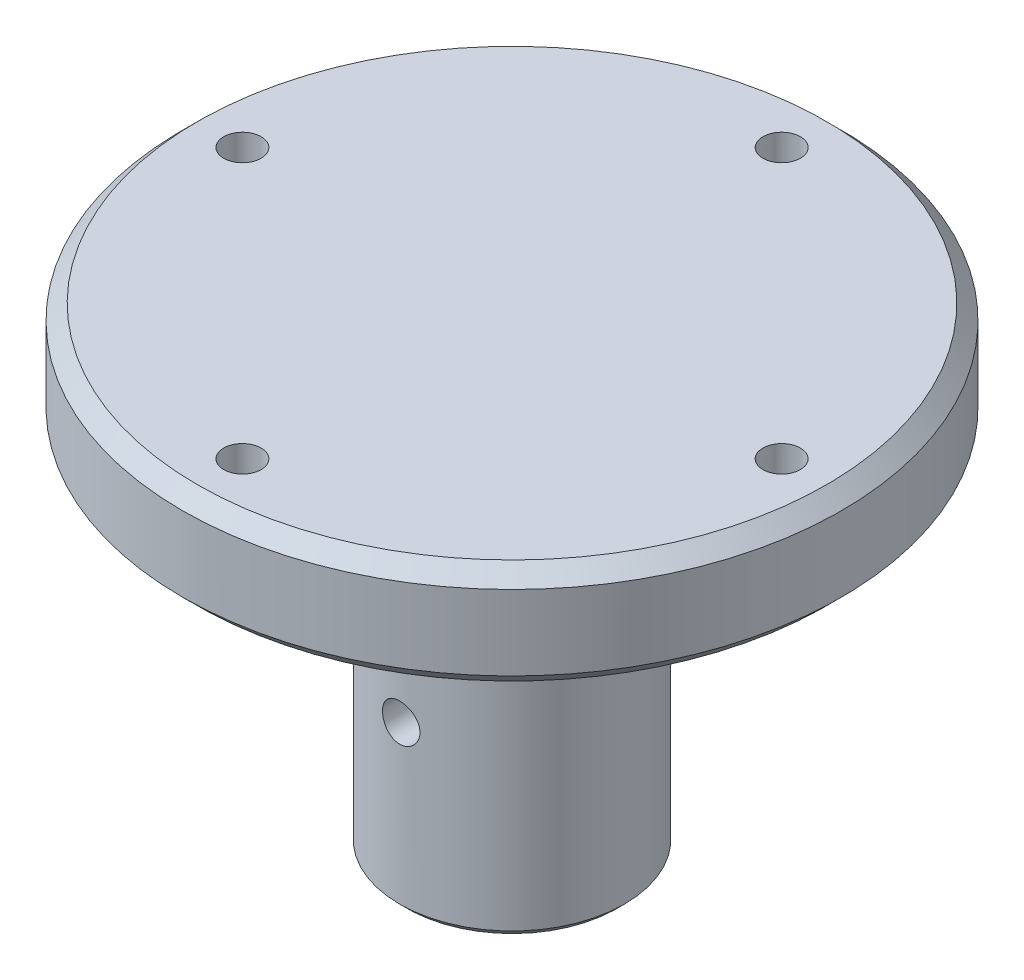
ISO-10303-21;
HEADER;
FILE_DESCRIPTION(('STEP AP214'),'2;1');
FILE_NAME('part.step','',(''),(''),'','','');
FILE_SCHEMA(('AUTOMOTIVE_DESIGN { 1 0 10303 214 1 1 1 1 }'));
ENDSEC;
DATA;
#1=APPLICATION_CONTEXT('core data for automotive mechanical design processes');
#2=APPLICATION_PROTOCOL_DEFINITION('international standard','automotive_design',2000,#1);
#3=PRODUCT_CONTEXT('',#1,'mechanical');
#4=PRODUCT('Part','Part','',(#3));
#5=PRODUCT_RELATED_PRODUCT_CATEGORY('part','',(#4));
#6=PRODUCT_DEFINITION_FORMATION('','',#4);
#7=PRODUCT_DEFINITION_CONTEXT('part definition',#1,'design');
#8=PRODUCT_DEFINITION('design','',#6,#7);
#9=PRODUCT_DEFINITION_SHAPE('','',#8);
#10=(LENGTH_UNIT() NAMED_UNIT(*) SI_UNIT(.MILLI.,.METRE.));
#11=(NAMED_UNIT(*) PLANE_ANGLE_UNIT() SI_UNIT($,.RADIAN.));
#12=(NAMED_UNIT(*) SI_UNIT($,.STERADIAN.) SOLID_ANGLE_UNIT());
#13=UNCERTAINTY_MEASURE_WITH_UNIT(LENGTH_MEASURE(1.E-05),#10,'distance_accuracy_value','');
#14=(GEOMETRIC_REPRESENTATION_CONTEXT(3) GLOBAL_UNCERTAINTY_ASSIGNED_CONTEXT((#13)) GLOBAL_UNIT_ASSIGNED_CONTEXT((#10,
#11,#12)) REPRESENTATION_CONTEXT('',''));
#15=CARTESIAN_POINT('',(0.,0.,0.));
#16=DIRECTION('',(0.,0.,1.));
#17=DIRECTION('',(1.,0.,0.));
#18=AXIS2_PLACEMENT_3D('',#15,#16,#17);
#19=CARTESIAN_POINT('',(0.,28.,0.));
#20=DIRECTION('',(0.,1.,0.));
#21=DIRECTION('',(0.,0.,1.));
#22=AXIS2_PLACEMENT_3D('',#19,#20,#21);
#23=CYLINDRICAL_SURFACE('',#22,7.5);
#24=CARTESIAN_POINT('',(0.,-2.99999999999999,0.));
#25=DIRECTION('',(0.,-1.,0.));
#26=DIRECTION('',(0.,0.,-1.));
#27=AXIS2_PLACEMENT_3D('',#24,#25,#26);
#28=CIRCLE('',#27,7.5);
#29=CARTESIAN_POINT('',(0.,-2.99999999999999,-7.5));
#30=VERTEX_POINT('',#29);
#31=EDGE_CURVE('E205',#30,#30,#28,.F.);
#32=ORIENTED_EDGE('',*,*,#31,.T.);
#33=EDGE_LOOP('',(#32));
#34=FACE_BOUND('',#33,.T.);
#35=CARTESIAN_POINT('',(0.,18.,0.));
#36=DIRECTION('',(0.,1.,0.));
#37=DIRECTION('',(0.,0.,1.));
#38=AXIS2_PLACEMENT_3D('',#35,#36,#37);
#39=CIRCLE('',#38,7.5);
#40=CARTESIAN_POINT('',(0.,18.,7.5));
#41=VERTEX_POINT('',#40);
#42=EDGE_CURVE('E155',#41,#41,#39,.T.);
#43=ORIENTED_EDGE('',*,*,#42,.F.);
#44=EDGE_LOOP('',(#43));
#45=FACE_BOUND('',#44,.T.);
#46=CARTESIAN_POINT('',(0.,6.25,7.5));
#47=CARTESIAN_POINT('',(-0.0696954524791074,6.2500027944739,7.49999880584412));
#48=CARTESIAN_POINT('',(-0.13942894091941,6.25584863748446,7.49901838956517));
#49=CARTESIAN_POINT('',(-0.276940110836521,6.27906782938266,7.49520172470694));
#50=CARTESIAN_POINT('',(-0.344715933979623,6.2964517784558,7.49236376961945));
#51=CARTESIAN_POINT('',(-0.476302373606322,6.34220772429637,7.48515034118225));
#52=CARTESIAN_POINT('',(-0.54011618421595,6.37057073282028,7.48077612579596));
#53=CARTESIAN_POINT('',(-0.662070920988972,6.43745614602619,7.47097113541035));
#54=CARTESIAN_POINT('',(-0.720212494939295,6.4759773887415,7.46554048127217));
#55=CARTESIAN_POINT('',(-0.82973630714584,6.56247754191023,7.45416658729156));
#56=CARTESIAN_POINT('',(-0.881056451767484,6.61053455731806,7.44821935907428));
#57=CARTESIAN_POINT('',(-0.974944249329964,6.7145739842364,7.43651313438366));
#58=CARTESIAN_POINT('',(-1.01751134969549,6.7705568957283,7.43075414981334));
#59=CARTESIAN_POINT('',(-1.09293356280257,6.88928548309852,7.4200378287989));
#60=CARTESIAN_POINT('',(-1.1257272764305,6.95207066840237,7.41508564545818));
#61=CARTESIAN_POINT('',(-1.18027918270561,7.08235478215031,7.40659894897337));
#62=CARTESIAN_POINT('',(-1.20203812078281,7.14985339183881,7.40306434007154));
#63=CARTESIAN_POINT('',(-1.2337071888924,7.28699013742827,7.39785268421378));
#64=CARTESIAN_POINT('',(-1.2437245145677,7.35660286825069,7.3961588424285));
#65=CARTESIAN_POINT('',(-1.25195836264494,7.49654013844173,7.39476969468325));
#66=CARTESIAN_POINT('',(-1.2501757201945,7.56686462708365,7.39507424728607));
#67=CARTESIAN_POINT('',(-1.23494754919808,7.70546393063772,7.39763214431778));
#68=CARTESIAN_POINT('',(-1.22162244094489,7.77375240177261,7.39986536659458));
#69=CARTESIAN_POINT('',(-1.18387657020172,7.90711065891456,7.40599747605504));
#70=CARTESIAN_POINT('',(-1.15945542715987,7.97218033444427,7.40989642036636));
#71=CARTESIAN_POINT('',(-1.10008862304696,8.09761441172046,7.4189423966705));
#72=CARTESIAN_POINT('',(-1.06509295693986,8.15795470304061,7.42409533553663));
#73=CARTESIAN_POINT('',(-0.985606008778716,8.27195220026919,7.43506459207504));
#74=CARTESIAN_POINT('',(-0.941113960327143,8.32560886622746,7.44088096327143));
#75=CARTESIAN_POINT('',(-0.843241106079526,8.42541304290367,7.45261013939893));
#76=CARTESIAN_POINT('',(-0.789756981936562,8.47145925927004,7.45852324615826));
#77=CARTESIAN_POINT('',(-0.675767624490822,8.55393888133267,7.46971300698362));
#78=CARTESIAN_POINT('',(-0.61526234595321,8.59037222509161,7.47498965694873));
#79=CARTESIAN_POINT('',(-0.488852958083355,8.65260111356814,7.48431946446456));
#80=CARTESIAN_POINT('',(-0.42294436278233,8.67838770966562,7.48837159203724));
#81=CARTESIAN_POINT('',(-0.287649172801365,8.71849710762299,7.4947875150633));
#82=CARTESIAN_POINT('',(-0.218262869589734,8.73282086848686,7.49715145175237));
#83=CARTESIAN_POINT('',(-0.0788549506508116,8.74946067923056,7.49990564921343));
#84=CARTESIAN_POINT('',(-0.00885036857550541,8.7519157859028,7.50031876506392));
#85=CARTESIAN_POINT('',(0.130569886444944,8.74511932778593,7.49918737210585));
#86=CARTESIAN_POINT('',(0.19998558194602,8.73586821343313,7.49764293862059));
#87=CARTESIAN_POINT('',(0.335828087773382,8.70603757533226,7.49278413469101));
#88=CARTESIAN_POINT('',(0.40227043419269,8.68552689580493,7.48948052400655));
#89=CARTESIAN_POINT('',(0.530773442430222,8.63383274090023,7.48147232227679));
#90=CARTESIAN_POINT('',(0.59283385795486,8.60264866618236,7.4767676525601));
#91=CARTESIAN_POINT('',(0.711415344734478,8.5301744376516,7.46642258151204));
#92=CARTESIAN_POINT('',(0.767882625468573,8.48879742191637,7.46077427943511));
#93=CARTESIAN_POINT('',(0.873121792751343,8.39723134230747,7.4491923369595));
#94=CARTESIAN_POINT('',(0.921893119848291,8.34704163836166,7.44325867585773));
#95=CARTESIAN_POINT('',(1.010871389829,8.23865122596428,7.43170087617923));
#96=CARTESIAN_POINT('',(1.05098438055686,8.18037291724279,7.42608058068553));
#97=CARTESIAN_POINT('',(1.12085115514749,8.05782351543073,7.41585764888942));
#98=CARTESIAN_POINT('',(1.15060526738491,7.99355261238625,7.4112549803301));
#99=CARTESIAN_POINT('',(1.19876916573657,7.86110513359393,7.40361726848852));
#100=CARTESIAN_POINT('',(1.21722571627397,7.79294595248475,7.40057577155532));
#101=CARTESIAN_POINT('',(1.24241772688914,7.65443993538911,7.3963885841763));
#102=CARTESIAN_POINT('',(1.24915420597308,7.58409329013397,7.39524272891361));
#103=CARTESIAN_POINT('',(1.25068643302368,7.44414741701879,7.39498366542006));
#104=CARTESIAN_POINT('',(1.24563006806259,7.37454981071235,7.39584528252825));
#105=CARTESIAN_POINT('',(1.22403991947842,7.23721037597461,7.39944890726864));
#106=CARTESIAN_POINT('',(1.20750617305624,7.16946854152906,7.40219090880607));
#107=CARTESIAN_POINT('',(1.16348724479745,7.03782078135369,7.40923678140859));
#108=CARTESIAN_POINT('',(1.13601479530022,6.97391049497198,7.41353883609835));
#109=CARTESIAN_POINT('',(1.07091350195795,6.85158216540257,7.42322184461104));
#110=CARTESIAN_POINT('',(1.03328415437428,6.79316439481393,7.428602851942));
#111=CARTESIAN_POINT('',(0.948409442186077,6.68273220844612,7.43991727022811));
#112=CARTESIAN_POINT('',(0.901055281796823,6.63080199164986,7.44585647788151));
#113=CARTESIAN_POINT('',(0.798304515690115,6.53557419776253,7.4575718618042));
#114=CARTESIAN_POINT('',(0.742906056456318,6.49227861568091,7.46334800013273));
#115=CARTESIAN_POINT('',(0.62518458482014,6.41527586590002,7.4741326482111));
#116=CARTESIAN_POINT('',(0.562816393766409,6.38163698034352,7.47913558126552));
#117=CARTESIAN_POINT('',(0.43325653468949,6.32536525769504,7.48775583800888));
#118=CARTESIAN_POINT('',(0.366069747415004,6.30272145946015,7.49137454088741));
#119=CARTESIAN_POINT('',(0.2488516550227,6.27399736293666,7.49602895416478));
#120=CARTESIAN_POINT('',(0.199529415149223,6.26501276519201,7.49751013636679));
#121=CARTESIAN_POINT('',(0.100144655159904,6.25301313107762,7.4994960799306));
#122=CARTESIAN_POINT('',(0.050082147804247,6.24999799193132,7.50000085810321));
#123=CARTESIAN_POINT('',(0.,6.25,7.5));
#124=B_SPLINE_CURVE_WITH_KNOTS('',3,(#46,#47,#48,#49,#50,#51,#52,#53,#54,#55,#56,#57,#58,#59,
#60,#61,#62,#63,#64,#65,#66,#67,#68,#69,#70,#71,#72,#73,#74,#75,#76,#77,#78,#79,#80,#81,#82,#83,
#84,#85,#86,#87,#88,#89,#90,#91,#92,#93,#94,#95,#96,#97,#98,#99,#100,#101,#102,#103,#104,#105,
#106,#107,#108,#109,#110,#111,#112,#113,#114,#115,#116,#117,#118,#119,#120,#121,#122,#123),
.UNSPECIFIED.,.T.,.F.,(4,2,2,2,2,2,2,2,2,2,2,2,2,2,2,2,2,2,2,2,2,2,2,2,2,2,2,2,2,2,2,2,2,2,2,2,
2,2,4),(0.,0.208903292469255,0.41799877284771,0.626923433512635,0.835824206337395,
1.04651245531166,1.25721400084928,1.4692126041192,1.68119688438091,1.89123038551712,
2.10124902160443,2.30910260880204,2.51696332512691,2.72582278316279,2.93469910340287,
3.14616384955663,3.35762995817924,3.56927344457952,3.78089922260574,3.99003941745699,
4.1991715651793,4.40703903503208,4.61491817913033,4.82463412813512,5.03436531527141,
5.24626911003809,5.45816618687971,5.66918011170886,5.88017568893309,6.0885395476135,
6.29690273094066,6.50502409113111,6.71315577514668,6.92375692096696,7.13440666939486,
7.346511158036,7.55840376065036,7.70852124082009,7.85863613638484),.UNSPECIFIED.);
#125=CARTESIAN_POINT('',(0.,6.25,7.5));
#126=VERTEX_POINT('',#125);
#127=EDGE_CURVE('E124',#126,#126,#124,.T.);
#128=ORIENTED_EDGE('',*,*,#127,.T.);
#129=EDGE_LOOP('',(#128));
#130=FACE_BOUND('',#129,.T.);
#131=ADVANCED_FACE('F39',(#34,#45,#130),#23,.T.);
#132=CARTESIAN_POINT('',(0.,28.,0.));
#133=DIRECTION('',(0.,1.,0.));
#134=DIRECTION('',(0.,0.,1.));
#135=AXIS2_PLACEMENT_3D('',#132,#133,#134);
#136=CYLINDRICAL_SURFACE('',#135,5.25);
#137=CARTESIAN_POINT('',(0.,-3.5,0.));
#138=DIRECTION('',(0.,-1.,0.));
#139=DIRECTION('',(0.,0.,-1.));
#140=AXIS2_PLACEMENT_3D('',#137,#138,#139);
#141=CIRCLE('',#140,5.25);
#142=CARTESIAN_POINT('',(0.,-3.5,-5.25));
#143=VERTEX_POINT('',#142);
#144=EDGE_CURVE('E131',#143,#143,#141,.T.);
#145=ORIENTED_EDGE('',*,*,#144,.T.);
#146=EDGE_LOOP('',(#145));
#147=FACE_BOUND('',#146,.T.);
#148=CARTESIAN_POINT('',(0.,18.,0.));
#149=DIRECTION('',(0.,1.,0.));
#150=DIRECTION('',(0.,0.,1.));
#151=AXIS2_PLACEMENT_3D('',#148,#149,#150);
#152=CIRCLE('',#151,5.25);
#153=CARTESIAN_POINT('',(0.,18.,5.25));
#154=VERTEX_POINT('',#153);
#155=EDGE_CURVE('E217',#154,#154,#152,.T.);
#156=ORIENTED_EDGE('',*,*,#155,.T.);
#157=EDGE_LOOP('',(#156));
#158=FACE_BOUND('',#157,.T.);
#159=CARTESIAN_POINT('',(0.,6.25,5.25));
#160=CARTESIAN_POINT('',(0.0691680686395409,6.25000212090374,5.24999877172941));
#161=CARTESIAN_POINT('',(0.138360554784569,6.25576041223236,5.24861935169754));
#162=CARTESIAN_POINT('',(0.274769425378824,6.27861114335809,5.24325005425527));
#163=CARTESIAN_POINT('',(0.34198454716393,6.29571066789117,5.23925854512409));
#164=CARTESIAN_POINT('',(0.472448526403737,6.34066948630875,5.2291080308497));
#165=CARTESIAN_POINT('',(0.53570180937274,6.36851651639877,5.22295149688797));
#166=CARTESIAN_POINT('',(0.65663806877896,6.43413835481243,5.20913006027443));
#167=CARTESIAN_POINT('',(0.714320985998155,6.47191326866256,5.20146514158976));
#168=CARTESIAN_POINT('',(0.823564922672426,6.55706966744816,5.18530085751388));
#169=CARTESIAN_POINT('',(0.875006204130396,6.60460251129248,5.17678959319304));
#170=CARTESIAN_POINT('',(0.969266898418434,6.70760107819039,5.15997279770312));
#171=CARTESIAN_POINT('',(1.01208542302238,6.76306761748476,5.15166728780591));
#172=CARTESIAN_POINT('',(1.08843443993912,6.88127123760563,5.13608352132232));
#173=CARTESIAN_POINT('',(1.12183355232848,6.94409535790147,5.12882042927914));
#174=CARTESIAN_POINT('',(1.177551649953,7.07466680545168,5.11631635350492));
#175=CARTESIAN_POINT('',(1.1998722271293,7.14241342375799,5.11107507927089));
#176=CARTESIAN_POINT('',(1.2323961959208,7.27959694428074,5.10332996022905));
#177=CARTESIAN_POINT('',(1.2428136090463,7.34898031812985,5.10077783159059));
#178=CARTESIAN_POINT('',(1.25190173722783,7.48855324997177,5.09855525266107));
#179=CARTESIAN_POINT('',(1.25057417589362,7.55874268816241,5.09888437953714));
#180=CARTESIAN_POINT('',(1.23638137776679,7.69631482810458,5.1023435974099));
#181=CARTESIAN_POINT('',(1.22376859252614,7.76372535329093,5.10541239830265));
#182=CARTESIAN_POINT('',(1.18776500120499,7.89544513029449,5.11390782054308));
#183=CARTESIAN_POINT('',(1.16437349128584,7.9597541792858,5.11933459586254));
#184=CARTESIAN_POINT('',(1.10725479569322,8.08413534395708,5.13199238726162));
#185=CARTESIAN_POINT('',(1.07343384938,8.14416267946686,5.13923965526495));
#186=CARTESIAN_POINT('',(0.996482037436221,8.25778176380062,5.15471236628343));
#187=CARTESIAN_POINT('',(0.95334968343075,8.31137248163446,5.1629379655847));
#188=CARTESIAN_POINT('',(0.857680386906595,8.41204655088141,5.17970054395313));
#189=CARTESIAN_POINT('',(0.804929740919126,8.45892662971735,5.18824008485406));
#190=CARTESIAN_POINT('',(0.692215006411049,8.54321162863139,5.20447648042823));
#191=CARTESIAN_POINT('',(0.632250736032499,8.58061630975759,5.21217331384718));
#192=CARTESIAN_POINT('',(0.506537525314541,8.64495357914496,5.2258897870934));
#193=CARTESIAN_POINT('',(0.440772414869066,8.67185568254828,5.23190453034941));
#194=CARTESIAN_POINT('',(0.305478953926926,8.71416797518822,5.24154327338564));
#195=CARTESIAN_POINT('',(0.235951256816263,8.72958015286483,5.24516768682245));
#196=CARTESIAN_POINT('',(0.0968464143009734,8.74817052668575,5.24955710210653));
#197=CARTESIAN_POINT('',(0.0273082978944183,8.75162586554676,5.25038686760684));
#198=CARTESIAN_POINT('',(-0.111352028931327,8.74696106537931,5.24927677707357));
#199=CARTESIAN_POINT('',(-0.180474272641646,8.73884186562914,5.24733714577758));
#200=CARTESIAN_POINT('',(-0.315395370774877,8.71148752162802,5.24094746133172));
#201=CARTESIAN_POINT('',(-0.381226148626263,8.69240126995477,5.23653105269405));
#202=CARTESIAN_POINT('',(-0.508749816183273,8.64382277373171,5.22568395100027));
#203=CARTESIAN_POINT('',(-0.570442311138487,8.61432953813585,5.21925306611427));
#204=CARTESIAN_POINT('',(-0.689058096044281,8.54522133692091,5.20493322327648));
#205=CARTESIAN_POINT('',(-0.745886451756852,8.50544813703924,5.19702205936491));
#206=CARTESIAN_POINT('',(-0.852161175457277,8.41711363871614,5.18065801778436));
#207=CARTESIAN_POINT('',(-0.901606392265088,8.36855097242568,5.17220505593123));
#208=CARTESIAN_POINT('',(-0.992835326997375,8.26273467368196,5.15548063856991));
#209=CARTESIAN_POINT('',(-1.03442554231205,8.20531266680804,5.14721732477685));
#210=CARTESIAN_POINT('',(-1.10737641230327,8.08413852935511,5.13201826888524));
#211=CARTESIAN_POINT('',(-1.13873752486724,8.02038668228673,5.12508246736874));
#212=CARTESIAN_POINT('',(-1.19011254195338,7.88871042870295,5.11339678176253));
#213=CARTESIAN_POINT('',(-1.21019322729826,7.82081327457785,5.10863406509623));
#214=CARTESIAN_POINT('',(-1.23862243697181,7.68247773791993,5.10181655477155));
#215=CARTESIAN_POINT('',(-1.24697324683998,7.61203985318688,5.09976123358818));
#216=CARTESIAN_POINT('',(-1.2515947705447,7.47258389321294,5.09862873365589));
#217=CARTESIAN_POINT('',(-1.24817370754124,7.4035764777074,5.09947556540881));
#218=CARTESIAN_POINT('',(-1.23004754603087,7.26715248142545,5.10387777717907));
#219=CARTESIAN_POINT('',(-1.21534263489508,7.19973587425242,5.10743311222103));
#220=CARTESIAN_POINT('',(-1.17522711610857,7.06870663236542,5.11681142310526));
#221=CARTESIAN_POINT('',(-1.14986921604156,7.00507700681989,5.12262322408568));
#222=CARTESIAN_POINT('',(-1.08921023192302,6.88293233401316,5.13586220161999));
#223=CARTESIAN_POINT('',(-1.05390789940594,6.82441793014765,5.14328958097363));
#224=CARTESIAN_POINT('',(-0.973373809024705,6.71266324453943,5.15914360656127));
#225=CARTESIAN_POINT('',(-0.927925850899425,6.65958151125096,5.16758981852093));
#226=CARTESIAN_POINT('',(-0.828818704906808,6.56169744092588,5.18440750389839));
#227=CARTESIAN_POINT('',(-0.775157594798894,6.51689704752197,5.19277895933318));
#228=CARTESIAN_POINT('',(-0.660111053414893,6.4361527446914,5.20866347099706));
#229=CARTESIAN_POINT('',(-0.598615739416763,6.40036206071934,5.21616064396593));
#230=CARTESIAN_POINT('',(-0.470311211532101,6.33968325310903,5.22928789587304));
#231=CARTESIAN_POINT('',(-0.403506113102599,6.31478678120443,5.2349194036692));
#232=CARTESIAN_POINT('',(-0.280618279359618,6.28059575959753,5.2427792175381));
#233=CARTESIAN_POINT('',(-0.225154654325348,6.2691459630838,5.24546914998374));
#234=CARTESIAN_POINT('',(-0.113132752873805,6.25384745029091,5.24907998898554));
#235=CARTESIAN_POINT('',(-0.0565745441810867,6.24999826525208,5.25000100463769));
#236=CARTESIAN_POINT('',(0.,6.25,5.25));
#237=B_SPLINE_CURVE_WITH_KNOTS('',3,(#159,#160,#161,#162,#163,#164,#165,#166,#167,#168,#169,
#170,#171,#172,#173,#174,#175,#176,#177,#178,#179,#180,#181,#182,#183,#184,#185,#186,#187,#188,
#189,#190,#191,#192,#193,#194,#195,#196,#197,#198,#199,#200,#201,#202,#203,#204,#205,#206,#207,
#208,#209,#210,#211,#212,#213,#214,#215,#216,#217,#218,#219,#220,#221,#222,#223,#224,#225,#226,
#227,#228,#229,#230,#231,#232,#233,#234,#235,#236),.UNSPECIFIED.,.T.,.F.,(4,2,2,2,2,2,2,2,2,2,2,
2,2,2,2,2,2,2,2,2,2,2,2,2,2,2,2,2,2,2,2,2,2,2,2,2,2,2,4),(0.,0.207296977965339,
0.414723574053834,0.621914175680715,0.829106979688583,1.03979628707083,1.25050728637022,
1.46402629710099,1.67751461711585,1.88710078686866,2.09665619974102,2.30163789536393,
2.50663297795925,2.71352751671416,2.92045515088892,3.13271505412589,3.34498030962961,
3.55785718660568,3.77069721467374,3.97856960347747,4.18642512431674,4.39152324140487,
4.59664089504288,4.80512629630423,5.01364417077024,5.22677100908705,5.43988830585367,
5.65173026760457,5.86353094670328,6.06982870351051,6.27612303476602,6.4814084897231,
6.68671972856785,6.89691430355396,7.10715814880005,7.32076697454769,7.53421182334509,
7.70377641625453,7.87333055112019),.UNSPECIFIED.);
#238=CARTESIAN_POINT('',(0.,6.25,5.25));
#239=VERTEX_POINT('',#238);
#240=EDGE_CURVE('E132',#239,#239,#237,.T.);
#241=ORIENTED_EDGE('',*,*,#240,.T.);
#242=EDGE_LOOP('',(#241));
#243=FACE_BOUND('',#242,.T.);
#244=ADVANCED_FACE('F159',(#147,#158,#243),#136,.F.);
#245=CARTESIAN_POINT('',(0.,18.,7.5));
#246=DIRECTION('',(0.,-1.,0.));
#247=DIRECTION('',(0.,0.,-1.));
#248=AXIS2_PLACEMENT_3D('',#245,#246,#247);
#249=PLANE('',#248);
#250=CARTESIAN_POINT('',(0.,18.,0.));
#251=DIRECTION('',(0.,-1.,0.));
#252=DIRECTION('',(0.,0.,-1.));
#253=AXIS2_PLACEMENT_3D('',#250,#251,#252);
#254=CIRCLE('',#253,8.5);
#255=CARTESIAN_POINT('',(0.,18.,-8.5));
#256=VERTEX_POINT('',#255);
#257=EDGE_CURVE('E259',#256,#256,#254,.T.);
#258=ORIENTED_EDGE('',*,*,#257,.T.);
#259=EDGE_LOOP('',(#258));
#260=FACE_BOUND('',#259,.T.);
#261=ORIENTED_EDGE('',*,*,#42,.T.);
#262=EDGE_LOOP('',(#261));
#263=FACE_BOUND('',#262,.T.);
#264=ADVANCED_FACE('F163',(#260,#263),#249,.T.);
#265=CARTESIAN_POINT('',(0.,28.,0.));
#266=DIRECTION('',(0.,1.,0.));
#267=DIRECTION('',(0.,0.,1.));
#268=AXIS2_PLACEMENT_3D('',#265,#266,#267);
#269=CYLINDRICAL_SURFACE('',#268,9.);
#270=CARTESIAN_POINT('',(0.,18.5,0.));
#271=DIRECTION('',(0.,-1.,0.));
#272=DIRECTION('',(0.,0.,-1.));
#273=AXIS2_PLACEMENT_3D('',#270,#271,#272);
#274=CIRCLE('',#273,9.);
#275=CARTESIAN_POINT('',(0.,18.5,-9.));
#276=VERTEX_POINT('',#275);
#277=EDGE_CURVE('E261',#276,#276,#274,.F.);
#278=ORIENTED_EDGE('',*,*,#277,.T.);
#279=EDGE_LOOP('',(#278));
#280=FACE_BOUND('',#279,.T.);
#281=CARTESIAN_POINT('',(0.,21.,0.));
#282=DIRECTION('',(0.,1.,0.));
#283=DIRECTION('',(0.,0.,1.));
#284=AXIS2_PLACEMENT_3D('',#281,#282,#283);
#285=CIRCLE('',#284,9.);
#286=CARTESIAN_POINT('',(0.,21.,9.));
#287=VERTEX_POINT('',#286);
#288=EDGE_CURVE('E214',#287,#287,#285,.T.);
#289=ORIENTED_EDGE('',*,*,#288,.F.);
#290=EDGE_LOOP('',(#289));
#291=FACE_BOUND('',#290,.T.);
#292=ADVANCED_FACE('F249',(#280,#291),#269,.T.);
#293=CARTESIAN_POINT('',(0.,21.,9.));
#294=DIRECTION('',(0.,-1.,0.));
#295=DIRECTION('',(0.,0.,-1.));
#296=AXIS2_PLACEMENT_3D('',#293,#294,#295);
#297=PLANE('',#296);
#298=CARTESIAN_POINT('',(0.,21.,-18.));
#299=DIRECTION('',(0.,-1.,0.));
#300=DIRECTION('',(0.,0.,-1.));
#301=AXIS2_PLACEMENT_3D('',#298,#299,#300);
#302=CIRCLE('',#301,1.25);
#303=CARTESIAN_POINT('',(0.,21.,-19.25));
#304=VERTEX_POINT('',#303);
#305=EDGE_CURVE('E317',#304,#304,#302,.T.);
#306=ORIENTED_EDGE('',*,*,#305,.F.);
#307=EDGE_LOOP('',(#306));
#308=FACE_BOUND('',#307,.T.);
#309=CARTESIAN_POINT('',(18.0000000000005,21.,-5.09386405508807E-13));
#310=DIRECTION('',(0.,-1.,0.));
#311=DIRECTION('',(0.,0.,-1.));
#312=AXIS2_PLACEMENT_3D('',#309,#310,#311);
#313=CIRCLE('',#312,1.25);
#314=CARTESIAN_POINT('',(18.0000000000005,21.,-1.25000000000051));
#315=VERTEX_POINT('',#314);
#316=EDGE_CURVE('E311',#315,#315,#313,.T.);
#317=ORIENTED_EDGE('',*,*,#316,.F.);
#318=EDGE_LOOP('',(#317));
#319=FACE_BOUND('',#318,.T.);
#320=CARTESIAN_POINT('',(1.01877281101761E-12,21.,18.));
#321=DIRECTION('',(0.,-1.,0.));
#322=DIRECTION('',(0.,0.,-1.));
#323=AXIS2_PLACEMENT_3D('',#320,#321,#322);
#324=CIRCLE('',#323,1.25);
#325=CARTESIAN_POINT('',(1.01877281101761E-12,21.,16.75));
#326=VERTEX_POINT('',#325);
#327=EDGE_CURVE('E305',#326,#326,#324,.T.);
#328=ORIENTED_EDGE('',*,*,#327,.F.);
#329=EDGE_LOOP('',(#328));
#330=FACE_BOUND('',#329,.T.);
#331=CARTESIAN_POINT('',(-17.9999999999995,21.,5.11590769747272E-13));
#332=DIRECTION('',(0.,-1.,0.));
#333=DIRECTION('',(0.,0.,-1.));
#334=AXIS2_PLACEMENT_3D('',#331,#332,#333);
#335=CIRCLE('',#334,1.25);
#336=CARTESIAN_POINT('',(-17.9999999999995,21.,-1.24999999999949));
#337=VERTEX_POINT('',#336);
#338=EDGE_CURVE('E299',#337,#337,#335,.T.);
#339=ORIENTED_EDGE('',*,*,#338,.F.);
#340=EDGE_LOOP('',(#339));
#341=FACE_BOUND('',#340,.T.);
#342=CARTESIAN_POINT('',(12.562594118092,21.,2.17801033608231));
#343=DIRECTION('',(0.,-1.,0.));
#344=DIRECTION('',(0.,0.,-1.));
#345=AXIS2_PLACEMENT_3D('',#342,#343,#344);
#346=CIRCLE('',#345,2.25);
#347=CARTESIAN_POINT('',(10.345665744311,21.,1.79365557089131));
#348=VERTEX_POINT('',#347);
#349=CARTESIAN_POINT('',(11.7930487956092,21.,4.2923187328506));
#350=VERTEX_POINT('',#349);
#351=EDGE_CURVE('E61',#348,#350,#346,.F.);
#352=ORIENTED_EDGE('',*,*,#351,.T.);
#353=CARTESIAN_POINT('',(12.562594118092,21.,2.17801033608231));
#354=DIRECTION('',(0.,-1.,0.));
#355=DIRECTION('',(0.,0.,-1.));
#356=AXIS2_PLACEMENT_3D('',#353,#354,#355);
#357=CIRCLE('',#356,2.25);
#358=CARTESIAN_POINT('',(14.7795224918729,21.,2.5623651012733));
#359=VERTEX_POINT('',#358);
#360=EDGE_CURVE('E98',#350,#359,#357,.F.);
#361=ORIENTED_EDGE('',*,*,#360,.T.);
#362=CARTESIAN_POINT('',(0.,21.,0.));
#363=DIRECTION('',(0.,-1.,0.));
#364=DIRECTION('',(0.,0.,-1.));
#365=AXIS2_PLACEMENT_3D('',#362,#363,#364);
#366=CIRCLE('',#365,15.);
#367=CARTESIAN_POINT('',(-14.7795224918729,21.,2.5623651012733));
#368=VERTEX_POINT('',#367);
#369=EDGE_CURVE('E116',#368,#359,#366,.T.);
#370=ORIENTED_EDGE('',*,*,#369,.F.);
#371=CARTESIAN_POINT('',(-12.562594118092,21.,2.17801033608231));
#372=DIRECTION('',(0.,-1.,0.));
#373=DIRECTION('',(0.,0.,-1.));
#374=AXIS2_PLACEMENT_3D('',#371,#372,#373);
#375=CIRCLE('',#374,2.25);
#376=CARTESIAN_POINT('',(-11.7930487956092,21.,4.2923187328506));
#377=VERTEX_POINT('',#376);
#378=EDGE_CURVE('E11',#368,#377,#375,.F.);
#379=ORIENTED_EDGE('',*,*,#378,.T.);
#380=CARTESIAN_POINT('',(-12.562594118092,21.,2.17801033608231));
#381=DIRECTION('',(0.,-1.,0.));
#382=DIRECTION('',(0.,0.,-1.));
#383=AXIS2_PLACEMENT_3D('',#380,#381,#382);
#384=CIRCLE('',#383,2.25);
#385=CARTESIAN_POINT('',(-10.345665744311,21.,1.79365557089131));
#386=VERTEX_POINT('',#385);
#387=EDGE_CURVE('E48',#377,#386,#384,.F.);
#388=ORIENTED_EDGE('',*,*,#387,.T.);
#389=CARTESIAN_POINT('',(0.,21.,0.));
#390=DIRECTION('',(0.,1.,0.));
#391=DIRECTION('',(0.,0.,-1.));
#392=AXIS2_PLACEMENT_3D('',#389,#390,#391);
#393=CIRCLE('',#392,10.5);
#394=EDGE_CURVE('E106',#348,#386,#393,.T.);
#395=ORIENTED_EDGE('',*,*,#394,.F.);
#396=EDGE_LOOP('',(#352,#361,#370,#379,#388,#395));
#397=FACE_BOUND('',#396,.T.);
#398=CARTESIAN_POINT('',(0.,21.,0.));
#399=DIRECTION('',(0.,-1.,0.));
#400=DIRECTION('',(0.,0.,-1.));
#401=AXIS2_PLACEMENT_3D('',#398,#399,#400);
#402=CIRCLE('',#401,21.);
#403=CARTESIAN_POINT('',(0.,21.,-21.));
#404=VERTEX_POINT('',#403);
#405=EDGE_CURVE('E271',#404,#404,#402,.T.);
#406=ORIENTED_EDGE('',*,*,#405,.T.);
#407=EDGE_LOOP('',(#406));
#408=FACE_BOUND('',#407,.T.);
#409=ORIENTED_EDGE('',*,*,#288,.T.);
#410=EDGE_LOOP('',(#409));
#411=FACE_BOUND('',#410,.T.);
#412=ADVANCED_FACE('F113',(#308,#319,#330,#341,#397,#408,#411),#297,.T.);
#413=CARTESIAN_POINT('',(0.,28.,0.));
#414=DIRECTION('',(0.,1.,0.));
#415=DIRECTION('',(0.,0.,1.));
#416=AXIS2_PLACEMENT_3D('',#413,#414,#415);
#417=CYLINDRICAL_SURFACE('',#416,22.);
#418=CARTESIAN_POINT('',(0.,22.,0.));
#419=DIRECTION('',(0.,-1.,0.));
#420=DIRECTION('',(0.,0.,-1.));
#421=AXIS2_PLACEMENT_3D('',#418,#419,#420);
#422=CIRCLE('',#421,22.);
#423=CARTESIAN_POINT('',(0.,22.,-22.));
#424=VERTEX_POINT('',#423);
#425=EDGE_CURVE('E264',#424,#424,#422,.F.);
#426=ORIENTED_EDGE('',*,*,#425,.T.);
#427=EDGE_LOOP('',(#426));
#428=FACE_BOUND('',#427,.T.);
#429=CARTESIAN_POINT('',(0.,27.,0.));
#430=DIRECTION('',(0.,1.,0.));
#431=DIRECTION('',(0.,0.,1.));
#432=AXIS2_PLACEMENT_3D('',#429,#430,#431);
#433=CIRCLE('',#432,22.);
#434=CARTESIAN_POINT('',(0.,27.,22.));
#435=VERTEX_POINT('',#434);
#436=EDGE_CURVE('E260',#435,#435,#433,.F.);
#437=ORIENTED_EDGE('',*,*,#436,.T.);
#438=EDGE_LOOP('',(#437));
#439=FACE_BOUND('',#438,.T.);
#440=ADVANCED_FACE('F234',(#428,#439),#417,.T.);
#441=CARTESIAN_POINT('',(0.,28.,22.));
#442=DIRECTION('',(0.,1.,0.));
#443=DIRECTION('',(0.,0.,1.));
#444=AXIS2_PLACEMENT_3D('',#441,#442,#443);
#445=PLANE('',#444);
#446=CARTESIAN_POINT('',(0.,28.,-18.));
#447=DIRECTION('',(0.,1.,0.));
#448=DIRECTION('',(0.,0.,1.));
#449=AXIS2_PLACEMENT_3D('',#446,#447,#448);
#450=CIRCLE('',#449,1.25);
#451=CARTESIAN_POINT('',(0.,28.,-16.75));
#452=VERTEX_POINT('',#451);
#453=EDGE_CURVE('E320',#452,#452,#450,.T.);
#454=ORIENTED_EDGE('',*,*,#453,.F.);
#455=EDGE_LOOP('',(#454));
#456=FACE_BOUND('',#455,.T.);
#457=CARTESIAN_POINT('',(18.0000000000005,28.,-5.09386405508807E-13));
#458=DIRECTION('',(0.,1.,0.));
#459=DIRECTION('',(0.,0.,1.));
#460=AXIS2_PLACEMENT_3D('',#457,#458,#459);
#461=CIRCLE('',#460,1.25);
#462=CARTESIAN_POINT('',(18.0000000000005,28.,1.24999999999949));
#463=VERTEX_POINT('',#462);
#464=EDGE_CURVE('E314',#463,#463,#461,.T.);
#465=ORIENTED_EDGE('',*,*,#464,.F.);
#466=EDGE_LOOP('',(#465));
#467=FACE_BOUND('',#466,.T.);
#468=CARTESIAN_POINT('',(1.01877281101761E-12,28.,18.));
#469=DIRECTION('',(0.,1.,0.));
#470=DIRECTION('',(0.,0.,1.));
#471=AXIS2_PLACEMENT_3D('',#468,#469,#470);
#472=CIRCLE('',#471,1.25);
#473=CARTESIAN_POINT('',(1.01877281101761E-12,28.,19.25));
#474=VERTEX_POINT('',#473);
#475=EDGE_CURVE('E308',#474,#474,#472,.T.);
#476=ORIENTED_EDGE('',*,*,#475,.F.);
#477=EDGE_LOOP('',(#476));
#478=FACE_BOUND('',#477,.T.);
#479=CARTESIAN_POINT('',(-17.9999999999995,28.,5.11590769747272E-13));
#480=DIRECTION('',(0.,1.,0.));
#481=DIRECTION('',(0.,0.,1.));
#482=AXIS2_PLACEMENT_3D('',#479,#480,#481);
#483=CIRCLE('',#482,1.25);
#484=CARTESIAN_POINT('',(-17.9999999999995,28.,1.25000000000051));
#485=VERTEX_POINT('',#484);
#486=EDGE_CURVE('E302',#485,#485,#483,.T.);
#487=ORIENTED_EDGE('',*,*,#486,.F.);
#488=EDGE_LOOP('',(#487));
#489=FACE_BOUND('',#488,.T.);
#490=CARTESIAN_POINT('',(0.,28.,0.));
#491=DIRECTION('',(0.,1.,0.));
#492=DIRECTION('',(0.,0.,1.));
#493=AXIS2_PLACEMENT_3D('',#490,#491,#492);
#494=CIRCLE('',#493,21.);
#495=CARTESIAN_POINT('',(0.,28.,21.));
#496=VERTEX_POINT('',#495);
#497=EDGE_CURVE('E274',#496,#496,#494,.T.);
#498=ORIENTED_EDGE('',*,*,#497,.T.);
#499=EDGE_LOOP('',(#498));
#500=FACE_BOUND('',#499,.T.);
#501=ADVANCED_FACE('F227',(#456,#467,#478,#489,#500),#445,.T.);
#502=CARTESIAN_POINT('',(0.,-3.5,0.));
#503=DIRECTION('',(0.,-1.,0.));
#504=DIRECTION('',(0.,0.,-1.));
#505=AXIS2_PLACEMENT_3D('',#502,#503,#504);
#506=PLANE('',#505);
#507=CARTESIAN_POINT('',(0.,-3.5,0.));
#508=DIRECTION('',(0.,-1.,0.));
#509=DIRECTION('',(0.,0.,-1.));
#510=AXIS2_PLACEMENT_3D('',#507,#508,#509);
#511=CIRCLE('',#510,6.99999999999999);
#512=CARTESIAN_POINT('',(0.,-3.5,-6.99999999999999));
#513=VERTEX_POINT('',#512);
#514=EDGE_CURVE('E157',#513,#513,#511,.T.);
#515=ORIENTED_EDGE('',*,*,#514,.T.);
#516=EDGE_LOOP('',(#515));
#517=FACE_BOUND('',#516,.T.);
#518=ORIENTED_EDGE('',*,*,#144,.F.);
#519=EDGE_LOOP('',(#518));
#520=FACE_BOUND('',#519,.T.);
#521=ADVANCED_FACE('F146',(#517,#520),#506,.T.);
#522=CARTESIAN_POINT('',(0.,18.,5.25));
#523=DIRECTION('',(0.,-1.,0.));
#524=DIRECTION('',(0.,0.,-1.));
#525=AXIS2_PLACEMENT_3D('',#522,#523,#524);
#526=PLANE('',#525);
#527=ORIENTED_EDGE('',*,*,#155,.F.);
#528=EDGE_LOOP('',(#527));
#529=FACE_BOUND('',#528,.T.);
#530=ADVANCED_FACE('F143',(#529),#526,.T.);
#531=CARTESIAN_POINT('',(0.,7.5,22.));
#532=DIRECTION('',(0.,0.,-1.));
#533=DIRECTION('',(-1.,0.,0.));
#534=AXIS2_PLACEMENT_3D('',#531,#532,#533);
#535=CYLINDRICAL_SURFACE('',#534,1.25);
#536=ORIENTED_EDGE('',*,*,#127,.F.);
#537=EDGE_LOOP('',(#536));
#538=FACE_BOUND('',#537,.T.);
#539=ORIENTED_EDGE('',*,*,#240,.F.);
#540=EDGE_LOOP('',(#539));
#541=FACE_BOUND('',#540,.T.);
#542=ADVANCED_FACE('F137',(#538,#541),#535,.F.);
#543=CARTESIAN_POINT('',(0.,-3.5,0.));
#544=DIRECTION('',(0.,1.,0.));
#545=DIRECTION('',(0.,0.,1.));
#546=AXIS2_PLACEMENT_3D('',#543,#544,#545);
#547=CONICAL_SURFACE('',#546,6.99999999999999,0.785398163397442);
#548=ORIENTED_EDGE('',*,*,#31,.F.);
#549=EDGE_LOOP('',(#548));
#550=FACE_BOUND('',#549,.T.);
#551=ORIENTED_EDGE('',*,*,#514,.F.);
#552=EDGE_LOOP('',(#551));
#553=FACE_BOUND('',#552,.T.);
#554=ADVANCED_FACE('F142',(#550,#553),#547,.T.);
#555=CARTESIAN_POINT('',(0.,18.5,0.));
#556=DIRECTION('',(0.,1.,0.));
#557=DIRECTION('',(0.,0.,1.));
#558=AXIS2_PLACEMENT_3D('',#555,#556,#557);
#559=CONICAL_SURFACE('',#558,9.,0.78539816339746);
#560=ORIENTED_EDGE('',*,*,#257,.F.);
#561=EDGE_LOOP('',(#560));
#562=FACE_BOUND('',#561,.T.);
#563=ORIENTED_EDGE('',*,*,#277,.F.);
#564=EDGE_LOOP('',(#563));
#565=FACE_BOUND('',#564,.T.);
#566=ADVANCED_FACE('F167',(#562,#565),#559,.T.);
#567=CARTESIAN_POINT('',(0.,22.,0.));
#568=DIRECTION('',(0.,1.,0.));
#569=DIRECTION('',(0.,0.,1.));
#570=AXIS2_PLACEMENT_3D('',#567,#568,#569);
#571=CONICAL_SURFACE('',#570,22.,0.785398163397453);
#572=ORIENTED_EDGE('',*,*,#405,.F.);
#573=EDGE_LOOP('',(#572));
#574=FACE_BOUND('',#573,.T.);
#575=ORIENTED_EDGE('',*,*,#425,.F.);
#576=EDGE_LOOP('',(#575));
#577=FACE_BOUND('',#576,.T.);
#578=ADVANCED_FACE('F171',(#574,#577),#571,.T.);
#579=CARTESIAN_POINT('',(0.,28.,0.));
#580=DIRECTION('',(0.,-1.,0.));
#581=DIRECTION('',(0.,0.,-1.));
#582=AXIS2_PLACEMENT_3D('',#579,#580,#581);
#583=CONICAL_SURFACE('',#582,21.,0.785398163397441);
#584=ORIENTED_EDGE('',*,*,#436,.F.);
#585=EDGE_LOOP('',(#584));
#586=FACE_BOUND('',#585,.T.);
#587=ORIENTED_EDGE('',*,*,#497,.F.);
#588=EDGE_LOOP('',(#587));
#589=FACE_BOUND('',#588,.T.);
#590=ADVANCED_FACE('F175',(#586,#589),#583,.T.);
#591=CARTESIAN_POINT('',(0.,24.5,0.));
#592=DIRECTION('',(0.,-1.,0.));
#593=DIRECTION('',(0.,0.,-1.));
#594=AXIS2_PLACEMENT_3D('',#591,#592,#593);
#595=CYLINDRICAL_SURFACE('',#594,10.5);
#596=CARTESIAN_POINT('',(0.,24.5,0.));
#597=DIRECTION('',(0.,1.,0.));
#598=DIRECTION('',(0.,0.,-1.));
#599=AXIS2_PLACEMENT_3D('',#596,#597,#598);
#600=CIRCLE('',#599,10.5);
#601=CARTESIAN_POINT('',(10.345665744311,24.5,1.79365557089131));
#602=VERTEX_POINT('',#601);
#603=CARTESIAN_POINT('',(-10.345665744311,24.5,1.79365557089131));
#604=VERTEX_POINT('',#603);
#605=EDGE_CURVE('E109',#602,#604,#600,.T.);
#606=ORIENTED_EDGE('',*,*,#605,.F.);
#607=DIRECTION('',(0.,-1.,0.));
#608=VECTOR('',#607,1.);
#609=CARTESIAN_POINT('',(10.345665744311,24.5,1.79365557089131));
#610=LINE('',#609,#608);
#611=EDGE_CURVE('E95',#602,#348,#610,.T.);
#612=ORIENTED_EDGE('',*,*,#611,.T.);
#613=ORIENTED_EDGE('',*,*,#394,.T.);
#614=DIRECTION('',(0.,-1.,0.));
#615=VECTOR('',#614,1.);
#616=CARTESIAN_POINT('',(-10.345665744311,24.5,1.79365557089131));
#617=LINE('',#616,#615);
#618=EDGE_CURVE('E111',#386,#604,#617,.F.);
#619=ORIENTED_EDGE('',*,*,#618,.T.);
#620=EDGE_LOOP('',(#606,#612,#613,#619));
#621=FACE_BOUND('',#620,.T.);
#622=ADVANCED_FACE('F104',(#621),#595,.T.);
#623=CARTESIAN_POINT('',(0.,24.5,0.));
#624=DIRECTION('',(0.,-1.,0.));
#625=DIRECTION('',(0.,0.,-1.));
#626=AXIS2_PLACEMENT_3D('',#623,#624,#625);
#627=CYLINDRICAL_SURFACE('',#626,15.);
#628=ORIENTED_EDGE('',*,*,#369,.T.);
#629=DIRECTION('',(0.,-1.,0.));
#630=VECTOR('',#629,1.);
#631=CARTESIAN_POINT('',(14.7795224918729,24.5,2.5623651012733));
#632=LINE('',#631,#630);
#633=CARTESIAN_POINT('',(14.7795224918729,24.5,2.5623651012733));
#634=VERTEX_POINT('',#633);
#635=EDGE_CURVE('E99',#359,#634,#632,.F.);
#636=ORIENTED_EDGE('',*,*,#635,.T.);
#637=CARTESIAN_POINT('',(0.,24.5,0.));
#638=DIRECTION('',(0.,-1.,0.));
#639=DIRECTION('',(0.,0.,-1.));
#640=AXIS2_PLACEMENT_3D('',#637,#638,#639);
#641=CIRCLE('',#640,15.);
#642=CARTESIAN_POINT('',(-14.7795224918729,24.5,2.5623651012733));
#643=VERTEX_POINT('',#642);
#644=EDGE_CURVE('E121',#643,#634,#641,.T.);
#645=ORIENTED_EDGE('',*,*,#644,.F.);
#646=DIRECTION('',(0.,-1.,0.));
#647=VECTOR('',#646,1.);
#648=CARTESIAN_POINT('',(-14.7795224918729,24.5,2.5623651012733));
#649=LINE('',#648,#647);
#650=EDGE_CURVE('E285',#643,#368,#649,.T.);
#651=ORIENTED_EDGE('',*,*,#650,.T.);
#652=EDGE_LOOP('',(#628,#636,#645,#651));
#653=FACE_BOUND('',#652,.T.);
#654=ADVANCED_FACE('F291',(#653),#627,.F.);
#655=CARTESIAN_POINT('',(0.,24.5,0.));
#656=DIRECTION('',(0.,-1.,0.));
#657=DIRECTION('',(0.,0.,-1.));
#658=AXIS2_PLACEMENT_3D('',#655,#656,#657);
#659=PLANE('',#658);
#660=CARTESIAN_POINT('',(12.562594118092,24.5,2.17801033608231));
#661=DIRECTION('',(0.,-1.,0.));
#662=DIRECTION('',(0.,0.,-1.));
#663=AXIS2_PLACEMENT_3D('',#660,#661,#662);
#664=CIRCLE('',#663,2.25);
#665=CARTESIAN_POINT('',(11.7930487956092,24.5,4.2923187328506));
#666=VERTEX_POINT('',#665);
#667=EDGE_CURVE('E281',#634,#666,#664,.T.);
#668=ORIENTED_EDGE('',*,*,#667,.T.);
#669=CARTESIAN_POINT('',(12.562594118092,24.5,2.17801033608231));
#670=DIRECTION('',(0.,-1.,0.));
#671=DIRECTION('',(0.,0.,-1.));
#672=AXIS2_PLACEMENT_3D('',#669,#670,#671);
#673=CIRCLE('',#672,2.25);
#674=EDGE_CURVE('E283',#666,#602,#673,.T.);
#675=ORIENTED_EDGE('',*,*,#674,.T.);
#676=ORIENTED_EDGE('',*,*,#605,.T.);
#677=CARTESIAN_POINT('',(-12.562594118092,24.5,2.17801033608231));
#678=DIRECTION('',(0.,-1.,0.));
#679=DIRECTION('',(0.,0.,-1.));
#680=AXIS2_PLACEMENT_3D('',#677,#678,#679);
#681=CIRCLE('',#680,2.25);
#682=CARTESIAN_POINT('',(-11.7930487956092,24.5,4.2923187328506));
#683=VERTEX_POINT('',#682);
#684=EDGE_CURVE('E279',#604,#683,#681,.T.);
#685=ORIENTED_EDGE('',*,*,#684,.T.);
#686=CARTESIAN_POINT('',(-12.562594118092,24.5,2.17801033608231));
#687=DIRECTION('',(0.,-1.,0.));
#688=DIRECTION('',(0.,0.,-1.));
#689=AXIS2_PLACEMENT_3D('',#686,#687,#688);
#690=CIRCLE('',#689,2.25);
#691=EDGE_CURVE('E110',#683,#643,#690,.T.);
#692=ORIENTED_EDGE('',*,*,#691,.T.);
#693=ORIENTED_EDGE('',*,*,#644,.T.);
#694=EDGE_LOOP('',(#668,#675,#676,#685,#692,#693));
#695=FACE_BOUND('',#694,.T.);
#696=ADVANCED_FACE('F184',(#695),#659,.T.);
#697=CARTESIAN_POINT('',(12.562594118092,24.5,2.17801033608231));
#698=DIRECTION('',(0.,-1.,0.));
#699=DIRECTION('',(0.,0.,-1.));
#700=AXIS2_PLACEMENT_3D('',#697,#698,#699);
#701=CYLINDRICAL_SURFACE('',#700,2.25);
#702=DIRECTION('',(0.,1.,0.));
#703=VECTOR('',#702,1.);
#704=CARTESIAN_POINT('',(11.7930487956092,21.,4.2923187328506));
#705=LINE('',#704,#703);
#706=EDGE_CURVE('E97',#666,#350,#705,.F.);
#707=ORIENTED_EDGE('',*,*,#706,.F.);
#708=ORIENTED_EDGE('',*,*,#667,.F.);
#709=ORIENTED_EDGE('',*,*,#635,.F.);
#710=ORIENTED_EDGE('',*,*,#360,.F.);
#711=EDGE_LOOP('',(#707,#708,#709,#710));
#712=FACE_BOUND('',#711,.T.);
#713=ADVANCED_FACE('F182',(#712),#701,.F.);
#714=CARTESIAN_POINT('',(12.562594118092,24.5,2.17801033608231));
#715=DIRECTION('',(0.,-1.,0.));
#716=DIRECTION('',(0.,0.,-1.));
#717=AXIS2_PLACEMENT_3D('',#714,#715,#716);
#718=CYLINDRICAL_SURFACE('',#717,2.25);
#719=ORIENTED_EDGE('',*,*,#674,.F.);
#720=ORIENTED_EDGE('',*,*,#706,.T.);
#721=ORIENTED_EDGE('',*,*,#351,.F.);
#722=ORIENTED_EDGE('',*,*,#611,.F.);
#723=EDGE_LOOP('',(#719,#720,#721,#722));
#724=FACE_BOUND('',#723,.T.);
#725=ADVANCED_FACE('F94',(#724),#718,.F.);
#726=CARTESIAN_POINT('',(-12.562594118092,24.5,2.17801033608231));
#727=DIRECTION('',(0.,-1.,0.));
#728=DIRECTION('',(0.,0.,-1.));
#729=AXIS2_PLACEMENT_3D('',#726,#727,#728);
#730=CYLINDRICAL_SURFACE('',#729,2.25);
#731=ORIENTED_EDGE('',*,*,#650,.F.);
#732=ORIENTED_EDGE('',*,*,#691,.F.);
#733=DIRECTION('',(0.,1.,0.));
#734=VECTOR('',#733,1.);
#735=CARTESIAN_POINT('',(-11.7930487956092,24.5,4.2923187328506));
#736=LINE('',#735,#734);
#737=EDGE_CURVE('E43',#377,#683,#736,.T.);
#738=ORIENTED_EDGE('',*,*,#737,.F.);
#739=ORIENTED_EDGE('',*,*,#378,.F.);
#740=EDGE_LOOP('',(#731,#732,#738,#739));
#741=FACE_BOUND('',#740,.T.);
#742=ADVANCED_FACE('F41',(#741),#730,.F.);
#743=CARTESIAN_POINT('',(-12.562594118092,24.5,2.17801033608231));
#744=DIRECTION('',(0.,-1.,0.));
#745=DIRECTION('',(0.,0.,-1.));
#746=AXIS2_PLACEMENT_3D('',#743,#744,#745);
#747=CYLINDRICAL_SURFACE('',#746,2.25);
#748=ORIENTED_EDGE('',*,*,#684,.F.);
#749=ORIENTED_EDGE('',*,*,#618,.F.);
#750=ORIENTED_EDGE('',*,*,#387,.F.);
#751=ORIENTED_EDGE('',*,*,#737,.T.);
#752=EDGE_LOOP('',(#748,#749,#750,#751));
#753=FACE_BOUND('',#752,.T.);
#754=ADVANCED_FACE('F186',(#753),#747,.F.);
#755=CARTESIAN_POINT('',(-17.9999999999995,28.,5.11590769747272E-13));
#756=DIRECTION('',(0.,1.,0.));
#757=DIRECTION('',(0.,0.,1.));
#758=AXIS2_PLACEMENT_3D('',#755,#756,#757);
#759=CYLINDRICAL_SURFACE('',#758,1.25);
#760=ORIENTED_EDGE('',*,*,#486,.T.);
#761=EDGE_LOOP('',(#760));
#762=FACE_BOUND('',#761,.T.);
#763=ORIENTED_EDGE('',*,*,#338,.T.);
#764=EDGE_LOOP('',(#763));
#765=FACE_BOUND('',#764,.T.);
#766=ADVANCED_FACE('F188',(#762,#765),#759,.F.);
#767=CARTESIAN_POINT('',(1.01877281101761E-12,28.,18.));
#768=DIRECTION('',(0.,1.,0.));
#769=DIRECTION('',(0.,0.,1.));
#770=AXIS2_PLACEMENT_3D('',#767,#768,#769);
#771=CYLINDRICAL_SURFACE('',#770,1.25);
#772=ORIENTED_EDGE('',*,*,#475,.T.);
#773=EDGE_LOOP('',(#772));
#774=FACE_BOUND('',#773,.T.);
#775=ORIENTED_EDGE('',*,*,#327,.T.);
#776=EDGE_LOOP('',(#775));
#777=FACE_BOUND('',#776,.T.);
#778=ADVANCED_FACE('F194',(#774,#777),#771,.F.);
#779=CARTESIAN_POINT('',(18.0000000000005,28.,-5.09386405508807E-13));
#780=DIRECTION('',(0.,1.,0.));
#781=DIRECTION('',(0.,0.,1.));
#782=AXIS2_PLACEMENT_3D('',#779,#780,#781);
#783=CYLINDRICAL_SURFACE('',#782,1.25);
#784=ORIENTED_EDGE('',*,*,#464,.T.);
#785=EDGE_LOOP('',(#784));
#786=FACE_BOUND('',#785,.T.);
#787=ORIENTED_EDGE('',*,*,#316,.T.);
#788=EDGE_LOOP('',(#787));
#789=FACE_BOUND('',#788,.T.);
#790=ADVANCED_FACE('F326',(#786,#789),#783,.F.);
#791=CARTESIAN_POINT('',(0.,28.,-18.));
#792=DIRECTION('',(0.,1.,0.));
#793=DIRECTION('',(0.,0.,1.));
#794=AXIS2_PLACEMENT_3D('',#791,#792,#793);
#795=CYLINDRICAL_SURFACE('',#794,1.25);
#796=ORIENTED_EDGE('',*,*,#453,.T.);
#797=EDGE_LOOP('',(#796));
#798=FACE_BOUND('',#797,.T.);
#799=ORIENTED_EDGE('',*,*,#305,.T.);
#800=EDGE_LOOP('',(#799));
#801=FACE_BOUND('',#800,.T.);
#802=ADVANCED_FACE('F323',(#798,#801),#795,.F.);
#803=CLOSED_SHELL('',(#131,#244,#264,#292,#412,#440,#501,#521,#530,#542,#554,#566,#578,#590,
#622,#654,#696,#713,#725,#742,#754,#766,#778,#790,#802));
#804=MANIFOLD_SOLID_BREP('B2',#803);
#805=ADVANCED_BREP_SHAPE_REPRESENTATION('',(#18,#804),#14);
#806=SHAPE_DEFINITION_REPRESENTATION(#9,#805);
ENDSEC;
END-ISO-10303-21;
